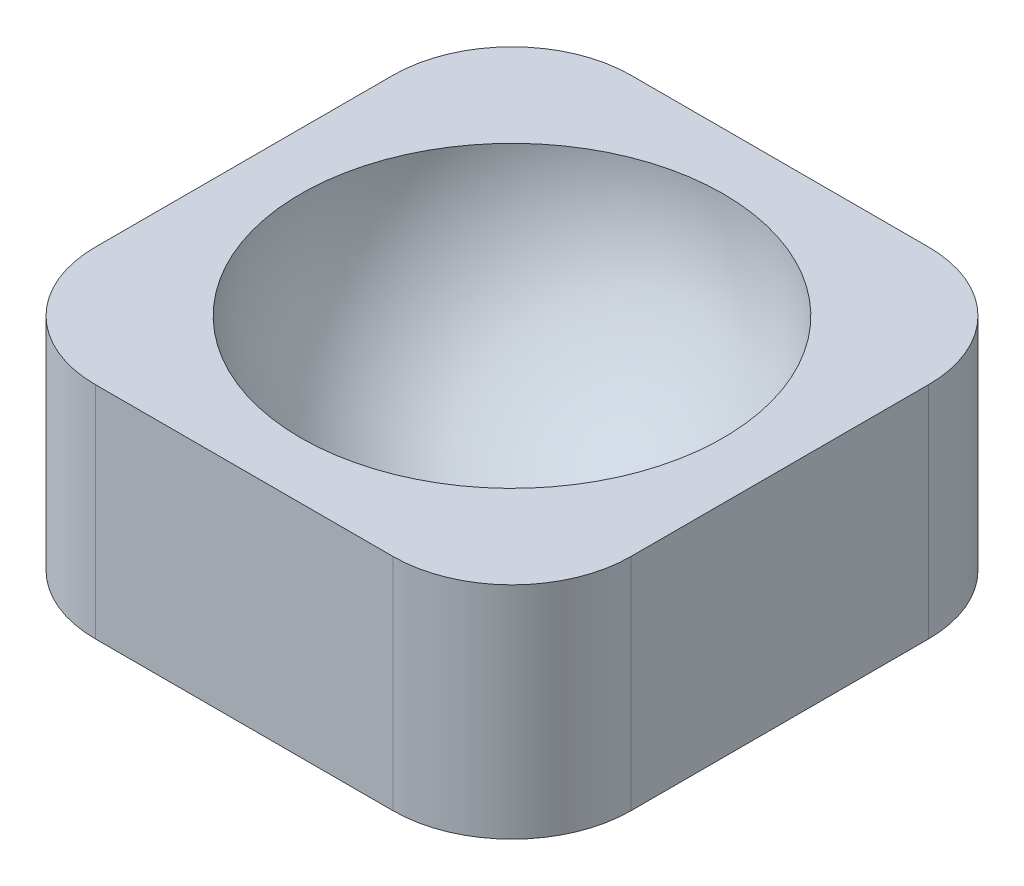
ISO-10303-21;
HEADER;
FILE_DESCRIPTION(('STEP AP214'),'2;1');
FILE_NAME('part.step','',(''),(''),'','','');
FILE_SCHEMA(('AUTOMOTIVE_DESIGN { 1 0 10303 214 1 1 1 1 }'));
ENDSEC;
DATA;
#1=APPLICATION_CONTEXT('core data for automotive mechanical design processes');
#2=APPLICATION_PROTOCOL_DEFINITION('international standard','automotive_design',2000,#1);
#3=PRODUCT_CONTEXT('',#1,'mechanical');
#4=PRODUCT('Part','Part','',(#3));
#5=PRODUCT_RELATED_PRODUCT_CATEGORY('part','',(#4));
#6=PRODUCT_DEFINITION_FORMATION('','',#4);
#7=PRODUCT_DEFINITION_CONTEXT('part definition',#1,'design');
#8=PRODUCT_DEFINITION('design','',#6,#7);
#9=PRODUCT_DEFINITION_SHAPE('','',#8);
#10=(LENGTH_UNIT() NAMED_UNIT(*) SI_UNIT(.MILLI.,.METRE.));
#11=(NAMED_UNIT(*) PLANE_ANGLE_UNIT() SI_UNIT($,.RADIAN.));
#12=(NAMED_UNIT(*) SI_UNIT($,.STERADIAN.) SOLID_ANGLE_UNIT());
#13=UNCERTAINTY_MEASURE_WITH_UNIT(LENGTH_MEASURE(1.E-05),#10,'distance_accuracy_value','');
#14=(GEOMETRIC_REPRESENTATION_CONTEXT(3) GLOBAL_UNCERTAINTY_ASSIGNED_CONTEXT((#13)) GLOBAL_UNIT_ASSIGNED_CONTEXT((#10,
#11,#12)) REPRESENTATION_CONTEXT('',''));
#15=CARTESIAN_POINT('',(0.,0.,0.));
#16=DIRECTION('',(0.,0.,1.));
#17=DIRECTION('',(1.,0.,0.));
#18=AXIS2_PLACEMENT_3D('',#15,#16,#17);
#19=CARTESIAN_POINT('',(-114.3,46.99,0.));
#20=DIRECTION('',(-1.,0.,0.));
#21=DIRECTION('',(0.,0.,1.));
#22=AXIS2_PLACEMENT_3D('',#19,#20,#21);
#23=PLANE('',#22);
#24=DIRECTION('',(0.,0.,-1.));
#25=VECTOR('',#24,1.);
#26=CARTESIAN_POINT('',(-114.3,0.,0.));
#27=LINE('',#26,#25);
#28=CARTESIAN_POINT('',(-114.3,0.,-25.4));
#29=VERTEX_POINT('',#28);
#30=CARTESIAN_POINT('',(-114.3,0.,-88.8999999999998));
#31=VERTEX_POINT('',#30);
#32=EDGE_CURVE('E138',#29,#31,#27,.T.);
#33=ORIENTED_EDGE('',*,*,#32,.F.);
#34=DIRECTION('',(0.,-1.,0.));
#35=VECTOR('',#34,1.);
#36=CARTESIAN_POINT('',(-114.3,46.99,-25.4));
#37=LINE('',#36,#35);
#38=CARTESIAN_POINT('',(-114.3,46.99,-25.4));
#39=VERTEX_POINT('',#38);
#40=EDGE_CURVE('E161',#29,#39,#37,.F.);
#41=ORIENTED_EDGE('',*,*,#40,.T.);
#42=DIRECTION('',(0.,0.,-1.));
#43=VECTOR('',#42,1.);
#44=CARTESIAN_POINT('',(-114.3,46.99,0.));
#45=LINE('',#44,#43);
#46=CARTESIAN_POINT('',(-114.3,46.99,-88.8999999999998));
#47=VERTEX_POINT('',#46);
#48=EDGE_CURVE('E136',#39,#47,#45,.T.);
#49=ORIENTED_EDGE('',*,*,#48,.T.);
#50=DIRECTION('',(0.,-1.,0.));
#51=VECTOR('',#50,1.);
#52=CARTESIAN_POINT('',(-114.3,0.,-88.8999999999998));
#53=LINE('',#52,#51);
#54=EDGE_CURVE('E158',#47,#31,#53,.T.);
#55=ORIENTED_EDGE('',*,*,#54,.T.);
#56=EDGE_LOOP('',(#33,#41,#49,#55));
#57=FACE_BOUND('',#56,.T.);
#58=ADVANCED_FACE('F43',(#57),#23,.T.);
#59=CARTESIAN_POINT('',(0.,46.99,0.));
#60=DIRECTION('',(0.,0.,1.));
#61=DIRECTION('',(1.,0.,0.));
#62=AXIS2_PLACEMENT_3D('',#59,#60,#61);
#63=PLANE('',#62);
#64=DIRECTION('',(-1.,0.,0.));
#65=VECTOR('',#64,1.);
#66=CARTESIAN_POINT('',(0.,0.,0.));
#67=LINE('',#66,#65);
#68=CARTESIAN_POINT('',(-25.4,0.,0.));
#69=VERTEX_POINT('',#68);
#70=CARTESIAN_POINT('',(-88.9000000000001,0.,0.));
#71=VERTEX_POINT('',#70);
#72=EDGE_CURVE('E134',#69,#71,#67,.T.);
#73=ORIENTED_EDGE('',*,*,#72,.F.);
#74=DIRECTION('',(0.,-1.,0.));
#75=VECTOR('',#74,1.);
#76=CARTESIAN_POINT('',(-25.4,46.99,0.));
#77=LINE('',#76,#75);
#78=CARTESIAN_POINT('',(-25.4,46.99,0.));
#79=VERTEX_POINT('',#78);
#80=EDGE_CURVE('E113',#69,#79,#77,.F.);
#81=ORIENTED_EDGE('',*,*,#80,.T.);
#82=DIRECTION('',(-1.,0.,0.));
#83=VECTOR('',#82,1.);
#84=CARTESIAN_POINT('',(0.,46.99,0.));
#85=LINE('',#84,#83);
#86=CARTESIAN_POINT('',(-88.9000000000001,46.99,0.));
#87=VERTEX_POINT('',#86);
#88=EDGE_CURVE('E177',#79,#87,#85,.T.);
#89=ORIENTED_EDGE('',*,*,#88,.T.);
#90=DIRECTION('',(0.,-1.,0.));
#91=VECTOR('',#90,1.);
#92=CARTESIAN_POINT('',(-88.9000000000001,46.99,0.));
#93=LINE('',#92,#91);
#94=EDGE_CURVE('E118',#87,#71,#93,.T.);
#95=ORIENTED_EDGE('',*,*,#94,.T.);
#96=EDGE_LOOP('',(#73,#81,#89,#95));
#97=FACE_BOUND('',#96,.T.);
#98=ADVANCED_FACE('F202',(#97),#63,.T.);
#99=CARTESIAN_POINT('',(0.,46.99,0.));
#100=DIRECTION('',(-1.,0.,0.));
#101=DIRECTION('',(0.,0.,1.));
#102=AXIS2_PLACEMENT_3D('',#99,#100,#101);
#103=PLANE('',#102);
#104=DIRECTION('',(0.,0.,-1.));
#105=VECTOR('',#104,1.);
#106=CARTESIAN_POINT('',(0.,46.99,0.));
#107=LINE('',#106,#105);
#108=CARTESIAN_POINT('',(0.,46.99,-25.4));
#109=VERTEX_POINT('',#108);
#110=CARTESIAN_POINT('',(0.,46.99,-88.8999999999999));
#111=VERTEX_POINT('',#110);
#112=EDGE_CURVE('E127',#109,#111,#107,.T.);
#113=ORIENTED_EDGE('',*,*,#112,.F.);
#114=DIRECTION('',(0.,-1.,0.));
#115=VECTOR('',#114,1.);
#116=CARTESIAN_POINT('',(0.,0.,-25.4));
#117=LINE('',#116,#115);
#118=CARTESIAN_POINT('',(0.,0.,-25.4));
#119=VERTEX_POINT('',#118);
#120=EDGE_CURVE('E112',#109,#119,#117,.T.);
#121=ORIENTED_EDGE('',*,*,#120,.T.);
#122=DIRECTION('',(0.,0.,-1.));
#123=VECTOR('',#122,1.);
#124=CARTESIAN_POINT('',(0.,0.,0.));
#125=LINE('',#124,#123);
#126=CARTESIAN_POINT('',(0.,0.,-88.8999999999999));
#127=VERTEX_POINT('',#126);
#128=EDGE_CURVE('E125',#119,#127,#125,.T.);
#129=ORIENTED_EDGE('',*,*,#128,.T.);
#130=DIRECTION('',(0.,-1.,0.));
#131=VECTOR('',#130,1.);
#132=CARTESIAN_POINT('',(0.,46.99,-88.8999999999999));
#133=LINE('',#132,#131);
#134=EDGE_CURVE('E129',#127,#111,#133,.F.);
#135=ORIENTED_EDGE('',*,*,#134,.T.);
#136=EDGE_LOOP('',(#113,#121,#129,#135));
#137=FACE_BOUND('',#136,.T.);
#138=ADVANCED_FACE('F124',(#137),#103,.F.);
#139=CARTESIAN_POINT('',(-1.52655665885959E-13,46.99,-114.3));
#140=DIRECTION('',(0.,0.,1.));
#141=DIRECTION('',(1.,0.,0.));
#142=AXIS2_PLACEMENT_3D('',#139,#140,#141);
#143=PLANE('',#142);
#144=DIRECTION('',(-1.,0.,0.));
#145=VECTOR('',#144,1.);
#146=CARTESIAN_POINT('',(-1.52655665885959E-13,0.,-114.3));
#147=LINE('',#146,#145);
#148=CARTESIAN_POINT('',(-25.4,0.,-114.3));
#149=VERTEX_POINT('',#148);
#150=CARTESIAN_POINT('',(-88.9000000000001,0.,-114.3));
#151=VERTEX_POINT('',#150);
#152=EDGE_CURVE('E133',#149,#151,#147,.T.);
#153=ORIENTED_EDGE('',*,*,#152,.T.);
#154=DIRECTION('',(0.,-1.,0.));
#155=VECTOR('',#154,1.);
#156=CARTESIAN_POINT('',(-88.9000000000001,46.99,-114.3));
#157=LINE('',#156,#155);
#158=CARTESIAN_POINT('',(-88.9000000000001,46.99,-114.3));
#159=VERTEX_POINT('',#158);
#160=EDGE_CURVE('E11',#151,#159,#157,.F.);
#161=ORIENTED_EDGE('',*,*,#160,.T.);
#162=DIRECTION('',(-1.,0.,0.));
#163=VECTOR('',#162,1.);
#164=CARTESIAN_POINT('',(-1.52655665885959E-13,46.99,-114.3));
#165=LINE('',#164,#163);
#166=CARTESIAN_POINT('',(-25.4,46.99,-114.3));
#167=VERTEX_POINT('',#166);
#168=EDGE_CURVE('E142',#167,#159,#165,.T.);
#169=ORIENTED_EDGE('',*,*,#168,.F.);
#170=DIRECTION('',(0.,-1.,0.));
#171=VECTOR('',#170,1.);
#172=CARTESIAN_POINT('',(-25.4,46.99,-114.3));
#173=LINE('',#172,#171);
#174=EDGE_CURVE('E51',#167,#149,#173,.T.);
#175=ORIENTED_EDGE('',*,*,#174,.T.);
#176=EDGE_LOOP('',(#153,#161,#169,#175));
#177=FACE_BOUND('',#176,.T.);
#178=ADVANCED_FACE('F164',(#177),#143,.F.);
#179=CARTESIAN_POINT('',(0.,46.99,0.));
#180=DIRECTION('',(0.,1.,0.));
#181=DIRECTION('',(0.,0.,1.));
#182=AXIS2_PLACEMENT_3D('',#179,#180,#181);
#183=PLANE('',#182);
#184=CARTESIAN_POINT('',(-57.15,46.99,-57.15));
#185=DIRECTION('',(0.,-1.,0.));
#186=DIRECTION('',(0.,0.,1.));
#187=AXIS2_PLACEMENT_3D('',#184,#185,#186);
#188=CIRCLE('',#187,45.085);
#189=CARTESIAN_POINT('',(-57.15,46.99,-12.065));
#190=VERTEX_POINT('',#189);
#191=EDGE_CURVE('E182',#190,#190,#188,.T.);
#192=ORIENTED_EDGE('',*,*,#191,.T.);
#193=EDGE_LOOP('',(#192));
#194=FACE_BOUND('',#193,.T.);
#195=ORIENTED_EDGE('',*,*,#88,.F.);
#196=CARTESIAN_POINT('',(-25.4,46.99,-25.4));
#197=DIRECTION('',(0.,1.,0.));
#198=DIRECTION('',(0.,0.,1.));
#199=AXIS2_PLACEMENT_3D('',#196,#197,#198);
#200=CIRCLE('',#199,25.4);
#201=EDGE_CURVE('E156',#79,#109,#200,.T.);
#202=ORIENTED_EDGE('',*,*,#201,.T.);
#203=ORIENTED_EDGE('',*,*,#112,.T.);
#204=CARTESIAN_POINT('',(-25.4,46.99,-88.8999999999999));
#205=DIRECTION('',(0.,1.,0.));
#206=DIRECTION('',(0.,0.,1.));
#207=AXIS2_PLACEMENT_3D('',#204,#205,#206);
#208=CIRCLE('',#207,25.4);
#209=EDGE_CURVE('E63',#111,#167,#208,.T.);
#210=ORIENTED_EDGE('',*,*,#209,.T.);
#211=ORIENTED_EDGE('',*,*,#168,.T.);
#212=CARTESIAN_POINT('',(-88.9000000000001,46.99,-88.8999999999998));
#213=DIRECTION('',(0.,1.,0.));
#214=DIRECTION('',(0.,0.,1.));
#215=AXIS2_PLACEMENT_3D('',#212,#213,#214);
#216=CIRCLE('',#215,25.4);
#217=EDGE_CURVE('E152',#159,#47,#216,.T.);
#218=ORIENTED_EDGE('',*,*,#217,.T.);
#219=ORIENTED_EDGE('',*,*,#48,.F.);
#220=CARTESIAN_POINT('',(-88.9000000000001,46.99,-25.4));
#221=DIRECTION('',(0.,1.,0.));
#222=DIRECTION('',(0.,0.,1.));
#223=AXIS2_PLACEMENT_3D('',#220,#221,#222);
#224=CIRCLE('',#223,25.4);
#225=EDGE_CURVE('E154',#39,#87,#224,.T.);
#226=ORIENTED_EDGE('',*,*,#225,.T.);
#227=EDGE_LOOP('',(#195,#202,#203,#210,#211,#218,#219,#226));
#228=FACE_BOUND('',#227,.T.);
#229=ADVANCED_FACE('F188',(#194,#228),#183,.T.);
#230=CARTESIAN_POINT('',(0.,0.,0.));
#231=DIRECTION('',(0.,1.,0.));
#232=DIRECTION('',(0.,0.,1.));
#233=AXIS2_PLACEMENT_3D('',#230,#231,#232);
#234=PLANE('',#233);
#235=ORIENTED_EDGE('',*,*,#128,.F.);
#236=CARTESIAN_POINT('',(-25.4,0.,-25.4));
#237=DIRECTION('',(0.,1.,0.));
#238=DIRECTION('',(0.,0.,1.));
#239=AXIS2_PLACEMENT_3D('',#236,#237,#238);
#240=CIRCLE('',#239,25.4);
#241=EDGE_CURVE('E108',#119,#69,#240,.F.);
#242=ORIENTED_EDGE('',*,*,#241,.T.);
#243=ORIENTED_EDGE('',*,*,#72,.T.);
#244=CARTESIAN_POINT('',(-88.9000000000001,0.,-25.4));
#245=DIRECTION('',(0.,1.,0.));
#246=DIRECTION('',(0.,0.,1.));
#247=AXIS2_PLACEMENT_3D('',#244,#245,#246);
#248=CIRCLE('',#247,25.4);
#249=EDGE_CURVE('E119',#71,#29,#248,.F.);
#250=ORIENTED_EDGE('',*,*,#249,.T.);
#251=ORIENTED_EDGE('',*,*,#32,.T.);
#252=CARTESIAN_POINT('',(-88.9000000000001,0.,-88.8999999999998));
#253=DIRECTION('',(0.,1.,0.));
#254=DIRECTION('',(0.,0.,1.));
#255=AXIS2_PLACEMENT_3D('',#252,#253,#254);
#256=CIRCLE('',#255,25.4);
#257=EDGE_CURVE('E145',#31,#151,#256,.F.);
#258=ORIENTED_EDGE('',*,*,#257,.T.);
#259=ORIENTED_EDGE('',*,*,#152,.F.);
#260=CARTESIAN_POINT('',(-25.4,0.,-88.8999999999999));
#261=DIRECTION('',(0.,1.,0.));
#262=DIRECTION('',(0.,0.,1.));
#263=AXIS2_PLACEMENT_3D('',#260,#261,#262);
#264=CIRCLE('',#263,25.4);
#265=EDGE_CURVE('E128',#149,#127,#264,.F.);
#266=ORIENTED_EDGE('',*,*,#265,.T.);
#267=EDGE_LOOP('',(#235,#242,#243,#250,#251,#258,#259,#266));
#268=FACE_BOUND('',#267,.T.);
#269=ADVANCED_FACE('F131',(#268),#234,.F.);
#270=CARTESIAN_POINT('',(-57.15,46.99,-57.15));
#271=DIRECTION('',(0.,0.,1.));
#272=DIRECTION('',(-1.,0.,0.));
#273=AXIS2_PLACEMENT_3D('',#270,#271,#272);
#274=SPHERICAL_SURFACE('',#273,45.085);
#275=CARTESIAN_POINT('',(-57.15,46.99,-57.15));
#276=DIRECTION('',(0.,-1.,0.));
#277=DIRECTION('',(0.,0.,1.));
#278=AXIS2_PLACEMENT_3D('',#275,#276,#277);
#279=SPHERICAL_SURFACE('',#278,45.085);
#280=ORIENTED_EDGE('',*,*,#191,.F.);
#281=EDGE_LOOP('',(#280));
#282=FACE_BOUND('',#281,.T.);
#283=ADVANCED_FACE('F190',(#282),#279,.F.);
#284=CARTESIAN_POINT('',(-25.4,46.99,-25.4));
#285=DIRECTION('',(0.,1.,0.));
#286=DIRECTION('',(0.,0.,1.));
#287=AXIS2_PLACEMENT_3D('',#284,#285,#286);
#288=CYLINDRICAL_SURFACE('',#287,25.4);
#289=ORIENTED_EDGE('',*,*,#201,.F.);
#290=ORIENTED_EDGE('',*,*,#80,.F.);
#291=ORIENTED_EDGE('',*,*,#241,.F.);
#292=ORIENTED_EDGE('',*,*,#120,.F.);
#293=EDGE_LOOP('',(#289,#290,#291,#292));
#294=FACE_BOUND('',#293,.T.);
#295=ADVANCED_FACE('F111',(#294),#288,.T.);
#296=CARTESIAN_POINT('',(-88.9000000000001,46.99,-25.4));
#297=DIRECTION('',(0.,-1.,0.));
#298=DIRECTION('',(0.,0.,-1.));
#299=AXIS2_PLACEMENT_3D('',#296,#297,#298);
#300=CYLINDRICAL_SURFACE('',#299,25.4);
#301=ORIENTED_EDGE('',*,*,#225,.F.);
#302=ORIENTED_EDGE('',*,*,#40,.F.);
#303=ORIENTED_EDGE('',*,*,#249,.F.);
#304=ORIENTED_EDGE('',*,*,#94,.F.);
#305=EDGE_LOOP('',(#301,#302,#303,#304));
#306=FACE_BOUND('',#305,.T.);
#307=ADVANCED_FACE('F197',(#306),#300,.T.);
#308=CARTESIAN_POINT('',(-88.9000000000001,46.99,-88.8999999999998));
#309=DIRECTION('',(0.,1.,0.));
#310=DIRECTION('',(0.,0.,1.));
#311=AXIS2_PLACEMENT_3D('',#308,#309,#310);
#312=CYLINDRICAL_SURFACE('',#311,25.4);
#313=ORIENTED_EDGE('',*,*,#217,.F.);
#314=ORIENTED_EDGE('',*,*,#160,.F.);
#315=ORIENTED_EDGE('',*,*,#257,.F.);
#316=ORIENTED_EDGE('',*,*,#54,.F.);
#317=EDGE_LOOP('',(#313,#314,#315,#316));
#318=FACE_BOUND('',#317,.T.);
#319=ADVANCED_FACE('F171',(#318),#312,.T.);
#320=CARTESIAN_POINT('',(-25.4,46.99,-88.8999999999999));
#321=DIRECTION('',(0.,-1.,0.));
#322=DIRECTION('',(0.,0.,-1.));
#323=AXIS2_PLACEMENT_3D('',#320,#321,#322);
#324=CYLINDRICAL_SURFACE('',#323,25.4);
#325=ORIENTED_EDGE('',*,*,#209,.F.);
#326=ORIENTED_EDGE('',*,*,#134,.F.);
#327=ORIENTED_EDGE('',*,*,#265,.F.);
#328=ORIENTED_EDGE('',*,*,#174,.F.);
#329=EDGE_LOOP('',(#325,#326,#327,#328));
#330=FACE_BOUND('',#329,.T.);
#331=ADVANCED_FACE('F45',(#330),#324,.T.);
#332=CLOSED_SHELL('',(#58,#98,#138,#178,#229,#269,#283,#295,#307,#319,#331));
#333=MANIFOLD_SOLID_BREP('B2',#332);
#334=ADVANCED_BREP_SHAPE_REPRESENTATION('',(#18,#333),#14);
#335=SHAPE_DEFINITION_REPRESENTATION(#9,#334);
ENDSEC;
END-ISO-10303-21;
